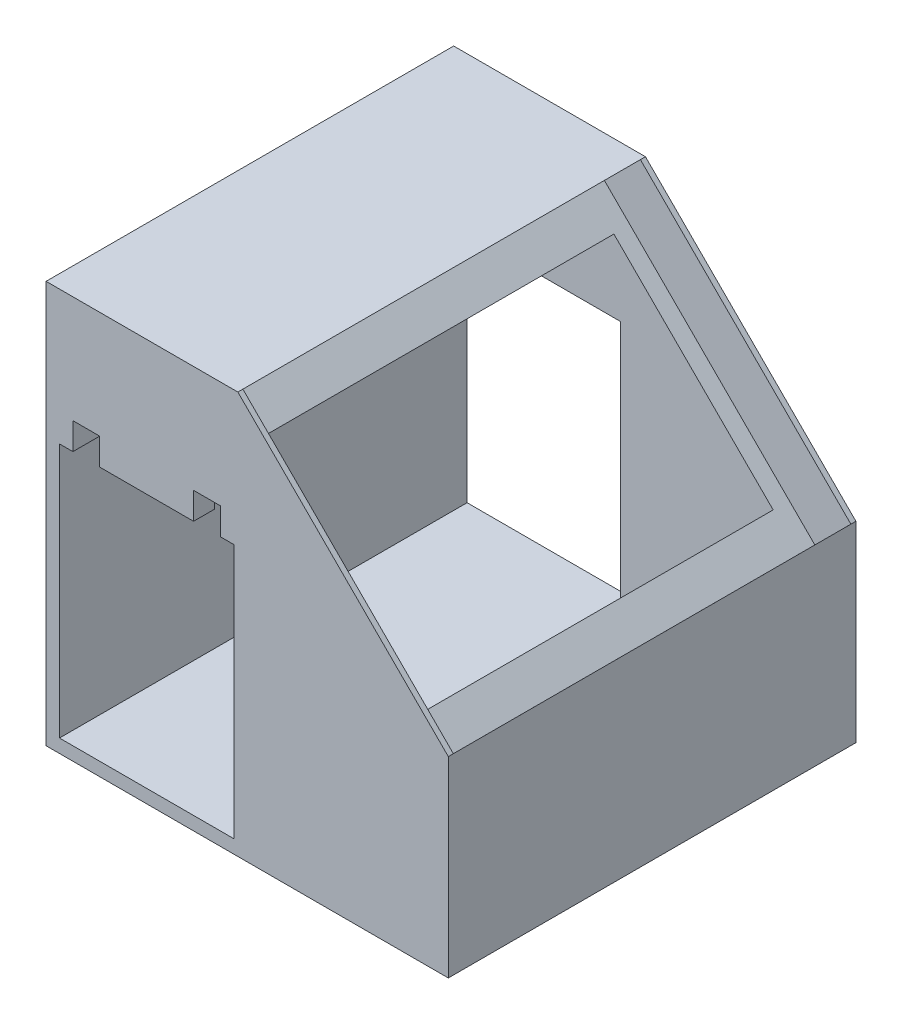
ISO-10303-21;
HEADER;
FILE_DESCRIPTION(('STEP AP214'),'2;1');
FILE_NAME('part.step','',(''),(''),'','','');
FILE_SCHEMA(('AUTOMOTIVE_DESIGN { 1 0 10303 214 1 1 1 1 }'));
ENDSEC;
DATA;
#1=APPLICATION_CONTEXT('core data for automotive mechanical design processes');
#2=APPLICATION_PROTOCOL_DEFINITION('international standard','automotive_design',2000,#1);
#3=PRODUCT_CONTEXT('',#1,'mechanical');
#4=PRODUCT('Part','Part','',(#3));
#5=PRODUCT_RELATED_PRODUCT_CATEGORY('part','',(#4));
#6=PRODUCT_DEFINITION_FORMATION('','',#4);
#7=PRODUCT_DEFINITION_CONTEXT('part definition',#1,'design');
#8=PRODUCT_DEFINITION('design','',#6,#7);
#9=PRODUCT_DEFINITION_SHAPE('','',#8);
#10=(LENGTH_UNIT() NAMED_UNIT(*) SI_UNIT(.MILLI.,.METRE.));
#11=(NAMED_UNIT(*) PLANE_ANGLE_UNIT() SI_UNIT($,.RADIAN.));
#12=(NAMED_UNIT(*) SI_UNIT($,.STERADIAN.) SOLID_ANGLE_UNIT());
#13=UNCERTAINTY_MEASURE_WITH_UNIT(LENGTH_MEASURE(1.E-05),#10,'distance_accuracy_value','');
#14=(GEOMETRIC_REPRESENTATION_CONTEXT(3) GLOBAL_UNCERTAINTY_ASSIGNED_CONTEXT((#13)) GLOBAL_UNIT_ASSIGNED_CONTEXT((#10,
#11,#12)) REPRESENTATION_CONTEXT('',''));
#15=CARTESIAN_POINT('',(0.,0.,0.));
#16=DIRECTION('',(0.,0.,1.));
#17=DIRECTION('',(1.,0.,0.));
#18=AXIS2_PLACEMENT_3D('',#15,#16,#17);
#19=CARTESIAN_POINT('',(5.,100.,152.));
#20=DIRECTION('',(0.,1.,0.));
#21=DIRECTION('',(0.,0.,1.));
#22=AXIS2_PLACEMENT_3D('',#19,#20,#21);
#23=PLANE('',#22);
#24=DIRECTION('',(0.,0.,1.));
#25=VECTOR('',#24,1.);
#26=CARTESIAN_POINT('',(20.,100.,112.));
#27=LINE('',#26,#25);
#28=CARTESIAN_POINT('',(20.,100.,118.));
#29=VERTEX_POINT('',#28);
#30=CARTESIAN_POINT('',(20.,100.,152.));
#31=VERTEX_POINT('',#30);
#32=EDGE_CURVE('E281',#29,#31,#27,.T.);
#33=ORIENTED_EDGE('',*,*,#32,.F.);
#34=DIRECTION('',(-1.,0.,0.));
#35=VECTOR('',#34,1.);
#36=CARTESIAN_POINT('',(20.,100.,118.));
#37=LINE('',#36,#35);
#38=CARTESIAN_POINT('',(40.6002750576431,100.,118.));
#39=VERTEX_POINT('',#38);
#40=EDGE_CURVE('E268',#39,#29,#37,.T.);
#41=ORIENTED_EDGE('',*,*,#40,.F.);
#42=DIRECTION('',(0.,0.,1.));
#43=VECTOR('',#42,1.);
#44=CARTESIAN_POINT('',(40.600275057643,100.,152.));
#45=LINE('',#44,#43);
#46=CARTESIAN_POINT('',(40.6002750576431,100.,144.125));
#47=VERTEX_POINT('',#46);
#48=EDGE_CURVE('E318',#39,#47,#45,.T.);
#49=ORIENTED_EDGE('',*,*,#48,.T.);
#50=DIRECTION('',(1.,0.,0.));
#51=VECTOR('',#50,1.);
#52=CARTESIAN_POINT('',(5.,100.,144.125));
#53=LINE('',#52,#51);
#54=CARTESIAN_POINT('',(55.,100.,144.125));
#55=VERTEX_POINT('',#54);
#56=EDGE_CURVE('E323',#47,#55,#53,.T.);
#57=ORIENTED_EDGE('',*,*,#56,.T.);
#58=DIRECTION('',(0.,0.,1.));
#59=VECTOR('',#58,1.);
#60=CARTESIAN_POINT('',(55.,100.,112.));
#61=LINE('',#60,#59);
#62=CARTESIAN_POINT('',(55.,100.,152.));
#63=VERTEX_POINT('',#62);
#64=EDGE_CURVE('E466',#55,#63,#61,.T.);
#65=ORIENTED_EDGE('',*,*,#64,.T.);
#66=DIRECTION('',(1.,0.,0.));
#67=VECTOR('',#66,1.);
#68=CARTESIAN_POINT('',(5.,100.,152.));
#69=LINE('',#68,#67);
#70=EDGE_CURVE('E372',#31,#63,#69,.T.);
#71=ORIENTED_EDGE('',*,*,#70,.F.);
#72=EDGE_LOOP('',(#33,#41,#49,#57,#65,#71));
#73=FACE_BOUND('',#72,.T.);
#74=ADVANCED_FACE('F64',(#73),#23,.F.);
#75=CARTESIAN_POINT('',(40.6002750576431,100.,7.87500000000002));
#76=VERTEX_POINT('',#75);
#77=CARTESIAN_POINT('',(40.6002750576431,100.,112.));
#78=VERTEX_POINT('',#77);
#79=EDGE_CURVE('E319',#76,#78,#45,.T.);
#80=ORIENTED_EDGE('',*,*,#79,.T.);
#81=DIRECTION('',(1.,0.,0.));
#82=VECTOR('',#81,1.);
#83=CARTESIAN_POINT('',(10.,100.,112.));
#84=LINE('',#83,#82);
#85=CARTESIAN_POINT('',(10.,100.,112.));
#86=VERTEX_POINT('',#85);
#87=EDGE_CURVE('E470',#86,#78,#84,.T.);
#88=ORIENTED_EDGE('',*,*,#87,.F.);
#89=DIRECTION('',(0.,0.,1.));
#90=VECTOR('',#89,1.);
#91=CARTESIAN_POINT('',(10.,100.,112.));
#92=LINE('',#91,#90);
#93=CARTESIAN_POINT('',(10.,100.,152.));
#94=VERTEX_POINT('',#93);
#95=EDGE_CURVE('E285',#86,#94,#92,.T.);
#96=ORIENTED_EDGE('',*,*,#95,.T.);
#97=CARTESIAN_POINT('',(5.,100.,152.));
#98=VERTEX_POINT('',#97);
#99=EDGE_CURVE('E368',#98,#94,#69,.T.);
#100=ORIENTED_EDGE('',*,*,#99,.F.);
#101=DIRECTION('',(0.,0.,-1.));
#102=VECTOR('',#101,1.);
#103=CARTESIAN_POINT('',(5.,100.,152.));
#104=LINE('',#103,#102);
#105=CARTESIAN_POINT('',(5.,100.,0.));
#106=VERTEX_POINT('',#105);
#107=EDGE_CURVE('E388',#98,#106,#104,.T.);
#108=ORIENTED_EDGE('',*,*,#107,.T.);
#109=DIRECTION('',(1.,0.,0.));
#110=VECTOR('',#109,1.);
#111=CARTESIAN_POINT('',(5.,100.,0.));
#112=LINE('',#111,#110);
#113=CARTESIAN_POINT('',(70.,100.,0.));
#114=VERTEX_POINT('',#113);
#115=EDGE_CURVE('E381',#106,#114,#112,.T.);
#116=ORIENTED_EDGE('',*,*,#115,.T.);
#117=DIRECTION('',(0.,0.,-1.));
#118=VECTOR('',#117,1.);
#119=CARTESIAN_POINT('',(70.,100.,152.));
#120=LINE('',#119,#118);
#121=CARTESIAN_POINT('',(70.,100.,7.87500000000002));
#122=VERTEX_POINT('',#121);
#123=EDGE_CURVE('E390',#122,#114,#120,.T.);
#124=ORIENTED_EDGE('',*,*,#123,.F.);
#125=DIRECTION('',(-1.,0.,0.));
#126=VECTOR('',#125,1.);
#127=CARTESIAN_POINT('',(5.,100.,7.87500000000002));
#128=LINE('',#127,#126);
#129=EDGE_CURVE('E313',#122,#76,#128,.T.);
#130=ORIENTED_EDGE('',*,*,#129,.T.);
#131=EDGE_LOOP('',(#80,#88,#96,#100,#108,#116,#124,#130));
#132=FACE_BOUND('',#131,.T.);
#133=ADVANCED_FACE('F482',(#132),#23,.F.);
#134=CARTESIAN_POINT('',(0.,0.,152.));
#135=DIRECTION('',(0.,0.,-1.));
#136=DIRECTION('',(-1.,0.,0.));
#137=AXIS2_PLACEMENT_3D('',#134,#135,#136);
#138=PLANE('',#137);
#139=DIRECTION('',(0.,1.,0.));
#140=VECTOR('',#139,1.);
#141=CARTESIAN_POINT('',(150.,0.,152.));
#142=LINE('',#141,#140);
#143=CARTESIAN_POINT('',(150.,0.,152.));
#144=VERTEX_POINT('',#143);
#145=CARTESIAN_POINT('',(150.,71.5111472899997,152.));
#146=VERTEX_POINT('',#145);
#147=EDGE_CURVE('E405',#144,#146,#142,.T.);
#148=ORIENTED_EDGE('',*,*,#147,.T.);
#149=DIRECTION('',(-0.707106781186546,0.707106781186549,0.));
#150=VECTOR('',#149,1.);
#151=CARTESIAN_POINT('',(71.51114729,150.,152.));
#152=LINE('',#151,#150);
#153=CARTESIAN_POINT('',(71.51114729,150.,152.));
#154=VERTEX_POINT('',#153);
#155=EDGE_CURVE('E434',#146,#154,#152,.T.);
#156=ORIENTED_EDGE('',*,*,#155,.T.);
#157=DIRECTION('',(1.,0.,0.));
#158=VECTOR('',#157,1.);
#159=CARTESIAN_POINT('',(0.,150.,152.));
#160=LINE('',#159,#158);
#161=CARTESIAN_POINT('',(0.,150.,152.));
#162=VERTEX_POINT('',#161);
#163=EDGE_CURVE('E401',#162,#154,#160,.T.);
#164=ORIENTED_EDGE('',*,*,#163,.F.);
#165=DIRECTION('',(0.,1.,0.));
#166=VECTOR('',#165,1.);
#167=CARTESIAN_POINT('',(0.,0.,152.));
#168=LINE('',#167,#166);
#169=CARTESIAN_POINT('',(0.,0.,152.));
#170=VERTEX_POINT('',#169);
#171=EDGE_CURVE('E398',#170,#162,#168,.T.);
#172=ORIENTED_EDGE('',*,*,#171,.F.);
#173=DIRECTION('',(1.,0.,0.));
#174=VECTOR('',#173,1.);
#175=CARTESIAN_POINT('',(0.,0.,152.));
#176=LINE('',#175,#174);
#177=EDGE_CURVE('E408',#170,#144,#176,.T.);
#178=ORIENTED_EDGE('',*,*,#177,.T.);
#179=EDGE_LOOP('',(#148,#156,#164,#172,#178));
#180=FACE_BOUND('',#179,.T.);
#181=ORIENTED_EDGE('',*,*,#70,.T.);
#182=DIRECTION('',(0.,-1.,0.));
#183=VECTOR('',#182,1.);
#184=CARTESIAN_POINT('',(55.,110.,152.));
#185=LINE('',#184,#183);
#186=CARTESIAN_POINT('',(55.,110.,152.));
#187=VERTEX_POINT('',#186);
#188=EDGE_CURVE('E494',#187,#63,#185,.T.);
#189=ORIENTED_EDGE('',*,*,#188,.F.);
#190=DIRECTION('',(-1.,0.,0.));
#191=VECTOR('',#190,1.);
#192=CARTESIAN_POINT('',(55.,110.,152.));
#193=LINE('',#192,#191);
#194=CARTESIAN_POINT('',(65.,110.,152.));
#195=VERTEX_POINT('',#194);
#196=EDGE_CURVE('E454',#195,#187,#193,.T.);
#197=ORIENTED_EDGE('',*,*,#196,.F.);
#198=DIRECTION('',(0.,1.,0.));
#199=VECTOR('',#198,1.);
#200=CARTESIAN_POINT('',(65.,110.,152.));
#201=LINE('',#200,#199);
#202=CARTESIAN_POINT('',(65.,100.,152.));
#203=VERTEX_POINT('',#202);
#204=EDGE_CURVE('E498',#203,#195,#201,.T.);
#205=ORIENTED_EDGE('',*,*,#204,.F.);
#206=CARTESIAN_POINT('',(70.,100.,152.));
#207=VERTEX_POINT('',#206);
#208=EDGE_CURVE('E367',#203,#207,#69,.T.);
#209=ORIENTED_EDGE('',*,*,#208,.T.);
#210=DIRECTION('',(0.,1.,0.));
#211=VECTOR('',#210,1.);
#212=CARTESIAN_POINT('',(70.,5.,152.));
#213=LINE('',#212,#211);
#214=CARTESIAN_POINT('',(70.,5.,152.));
#215=VERTEX_POINT('',#214);
#216=EDGE_CURVE('E363',#215,#207,#213,.T.);
#217=ORIENTED_EDGE('',*,*,#216,.F.);
#218=DIRECTION('',(1.,0.,0.));
#219=VECTOR('',#218,1.);
#220=CARTESIAN_POINT('',(5.,5.,152.));
#221=LINE('',#220,#219);
#222=CARTESIAN_POINT('',(5.,5.,152.));
#223=VERTEX_POINT('',#222);
#224=EDGE_CURVE('E361',#223,#215,#221,.T.);
#225=ORIENTED_EDGE('',*,*,#224,.F.);
#226=DIRECTION('',(0.,1.,0.));
#227=VECTOR('',#226,1.);
#228=CARTESIAN_POINT('',(5.,5.,152.));
#229=LINE('',#228,#227);
#230=EDGE_CURVE('E371',#223,#98,#229,.T.);
#231=ORIENTED_EDGE('',*,*,#230,.T.);
#232=ORIENTED_EDGE('',*,*,#99,.T.);
#233=DIRECTION('',(0.,-1.,0.));
#234=VECTOR('',#233,1.);
#235=CARTESIAN_POINT('',(10.,110.,152.));
#236=LINE('',#235,#234);
#237=CARTESIAN_POINT('',(10.,110.,152.));
#238=VERTEX_POINT('',#237);
#239=EDGE_CURVE('E457',#238,#94,#236,.T.);
#240=ORIENTED_EDGE('',*,*,#239,.F.);
#241=DIRECTION('',(-1.,0.,0.));
#242=VECTOR('',#241,1.);
#243=CARTESIAN_POINT('',(10.,110.,152.));
#244=LINE('',#243,#242);
#245=CARTESIAN_POINT('',(20.,110.,152.));
#246=VERTEX_POINT('',#245);
#247=EDGE_CURVE('E471',#246,#238,#244,.T.);
#248=ORIENTED_EDGE('',*,*,#247,.F.);
#249=DIRECTION('',(0.,1.,0.));
#250=VECTOR('',#249,1.);
#251=CARTESIAN_POINT('',(20.,110.,152.));
#252=LINE('',#251,#250);
#253=EDGE_CURVE('E278',#31,#246,#252,.T.);
#254=ORIENTED_EDGE('',*,*,#253,.F.);
#255=EDGE_LOOP('',(#181,#189,#197,#205,#209,#217,#225,#231,#232,#240,#248,#254));
#256=FACE_BOUND('',#255,.T.);
#257=ADVANCED_FACE('F477',(#180,#256),#138,.F.);
#258=CARTESIAN_POINT('',(0.,0.,0.));
#259=DIRECTION('',(0.,0.,-1.));
#260=DIRECTION('',(-1.,0.,0.));
#261=AXIS2_PLACEMENT_3D('',#258,#259,#260);
#262=PLANE('',#261);
#263=DIRECTION('',(1.,0.,0.));
#264=VECTOR('',#263,1.);
#265=CARTESIAN_POINT('',(0.,150.,0.));
#266=LINE('',#265,#264);
#267=CARTESIAN_POINT('',(0.,150.,0.));
#268=VERTEX_POINT('',#267);
#269=CARTESIAN_POINT('',(71.51114729,150.,0.));
#270=VERTEX_POINT('',#269);
#271=EDGE_CURVE('E413',#268,#270,#266,.T.);
#272=ORIENTED_EDGE('',*,*,#271,.T.);
#273=DIRECTION('',(0.707106781186546,-0.707106781186549,0.));
#274=VECTOR('',#273,1.);
#275=CARTESIAN_POINT('',(110.755573645,110.755573645,0.));
#276=LINE('',#275,#274);
#277=CARTESIAN_POINT('',(150.,71.5111472899997,0.));
#278=VERTEX_POINT('',#277);
#279=EDGE_CURVE('E430',#270,#278,#276,.T.);
#280=ORIENTED_EDGE('',*,*,#279,.T.);
#281=DIRECTION('',(0.,1.,0.));
#282=VECTOR('',#281,1.);
#283=CARTESIAN_POINT('',(150.,0.,0.));
#284=LINE('',#283,#282);
#285=CARTESIAN_POINT('',(150.,0.,0.));
#286=VERTEX_POINT('',#285);
#287=EDGE_CURVE('E416',#286,#278,#284,.T.);
#288=ORIENTED_EDGE('',*,*,#287,.F.);
#289=DIRECTION('',(1.,0.,0.));
#290=VECTOR('',#289,1.);
#291=CARTESIAN_POINT('',(0.,0.,0.));
#292=LINE('',#291,#290);
#293=CARTESIAN_POINT('',(0.,0.,0.));
#294=VERTEX_POINT('',#293);
#295=EDGE_CURVE('E402',#294,#286,#292,.T.);
#296=ORIENTED_EDGE('',*,*,#295,.F.);
#297=DIRECTION('',(0.,1.,0.));
#298=VECTOR('',#297,1.);
#299=CARTESIAN_POINT('',(0.,0.,0.));
#300=LINE('',#299,#298);
#301=EDGE_CURVE('E397',#294,#268,#300,.T.);
#302=ORIENTED_EDGE('',*,*,#301,.T.);
#303=EDGE_LOOP('',(#272,#280,#288,#296,#302));
#304=FACE_BOUND('',#303,.T.);
#305=DIRECTION('',(0.,1.,0.));
#306=VECTOR('',#305,1.);
#307=CARTESIAN_POINT('',(5.,5.,0.));
#308=LINE('',#307,#306);
#309=CARTESIAN_POINT('',(5.,5.,0.));
#310=VERTEX_POINT('',#309);
#311=EDGE_CURVE('E364',#310,#106,#308,.T.);
#312=ORIENTED_EDGE('',*,*,#311,.F.);
#313=DIRECTION('',(1.,0.,0.));
#314=VECTOR('',#313,1.);
#315=CARTESIAN_POINT('',(5.,5.,0.));
#316=LINE('',#315,#314);
#317=CARTESIAN_POINT('',(70.,5.,0.));
#318=VERTEX_POINT('',#317);
#319=EDGE_CURVE('E360',#310,#318,#316,.T.);
#320=ORIENTED_EDGE('',*,*,#319,.T.);
#321=DIRECTION('',(0.,1.,0.));
#322=VECTOR('',#321,1.);
#323=CARTESIAN_POINT('',(70.,5.,0.));
#324=LINE('',#323,#322);
#325=EDGE_CURVE('E378',#318,#114,#324,.T.);
#326=ORIENTED_EDGE('',*,*,#325,.T.);
#327=ORIENTED_EDGE('',*,*,#115,.F.);
#328=EDGE_LOOP('',(#312,#320,#326,#327));
#329=FACE_BOUND('',#328,.T.);
#330=ADVANCED_FACE('F534',(#304,#329),#262,.T.);
#331=CARTESIAN_POINT('',(0.,0.,152.));
#332=DIRECTION('',(-1.,0.,0.));
#333=DIRECTION('',(0.,0.,1.));
#334=AXIS2_PLACEMENT_3D('',#331,#332,#333);
#335=PLANE('',#334);
#336=ORIENTED_EDGE('',*,*,#301,.F.);
#337=DIRECTION('',(0.,0.,-1.));
#338=VECTOR('',#337,1.);
#339=CARTESIAN_POINT('',(0.,0.,152.));
#340=LINE('',#339,#338);
#341=EDGE_CURVE('E420',#170,#294,#340,.T.);
#342=ORIENTED_EDGE('',*,*,#341,.F.);
#343=ORIENTED_EDGE('',*,*,#171,.T.);
#344=DIRECTION('',(0.,0.,-1.));
#345=VECTOR('',#344,1.);
#346=CARTESIAN_POINT('',(0.,150.,152.));
#347=LINE('',#346,#345);
#348=EDGE_CURVE('E410',#162,#268,#347,.T.);
#349=ORIENTED_EDGE('',*,*,#348,.T.);
#350=EDGE_LOOP('',(#336,#342,#343,#349));
#351=FACE_BOUND('',#350,.T.);
#352=ADVANCED_FACE('F573',(#351),#335,.T.);
#353=CARTESIAN_POINT('',(0.,0.,152.));
#354=DIRECTION('',(0.,1.,0.));
#355=DIRECTION('',(0.,0.,1.));
#356=AXIS2_PLACEMENT_3D('',#353,#354,#355);
#357=PLANE('',#356);
#358=ORIENTED_EDGE('',*,*,#295,.T.);
#359=DIRECTION('',(0.,0.,-1.));
#360=VECTOR('',#359,1.);
#361=CARTESIAN_POINT('',(150.,0.,152.));
#362=LINE('',#361,#360);
#363=EDGE_CURVE('E423',#144,#286,#362,.T.);
#364=ORIENTED_EDGE('',*,*,#363,.F.);
#365=ORIENTED_EDGE('',*,*,#177,.F.);
#366=ORIENTED_EDGE('',*,*,#341,.T.);
#367=EDGE_LOOP('',(#358,#364,#365,#366));
#368=FACE_BOUND('',#367,.T.);
#369=ADVANCED_FACE('F575',(#368),#357,.F.);
#370=CARTESIAN_POINT('',(150.,0.,152.));
#371=DIRECTION('',(-1.,0.,0.));
#372=DIRECTION('',(0.,0.,1.));
#373=AXIS2_PLACEMENT_3D('',#370,#371,#372);
#374=PLANE('',#373);
#375=ORIENTED_EDGE('',*,*,#287,.T.);
#376=DIRECTION('',(0.,0.,1.));
#377=VECTOR('',#376,1.);
#378=CARTESIAN_POINT('',(150.,71.5111472899997,152.));
#379=LINE('',#378,#377);
#380=EDGE_CURVE('E432',#278,#146,#379,.T.);
#381=ORIENTED_EDGE('',*,*,#380,.T.);
#382=ORIENTED_EDGE('',*,*,#147,.F.);
#383=ORIENTED_EDGE('',*,*,#363,.T.);
#384=EDGE_LOOP('',(#375,#381,#382,#383));
#385=FACE_BOUND('',#384,.T.);
#386=ADVANCED_FACE('F578',(#385),#374,.F.);
#387=CARTESIAN_POINT('',(0.,150.,152.));
#388=DIRECTION('',(0.,1.,0.));
#389=DIRECTION('',(0.,0.,1.));
#390=AXIS2_PLACEMENT_3D('',#387,#388,#389);
#391=PLANE('',#390);
#392=DIRECTION('',(1.,0.,0.));
#393=VECTOR('',#392,1.);
#394=CARTESIAN_POINT('',(0.,150.,150.125));
#395=LINE('',#394,#393);
#396=CARTESIAN_POINT('',(71.5083919656064,150.,150.125));
#397=VERTEX_POINT('',#396);
#398=CARTESIAN_POINT('',(71.51114729,150.,150.125));
#399=VERTEX_POINT('',#398);
#400=EDGE_CURVE('E358',#397,#399,#395,.T.);
#401=ORIENTED_EDGE('',*,*,#400,.F.);
#402=DIRECTION('',(0.,0.,1.));
#403=VECTOR('',#402,1.);
#404=CARTESIAN_POINT('',(71.5083919656064,150.,152.));
#405=LINE('',#404,#403);
#406=CARTESIAN_POINT('',(71.5083919656064,150.,1.87500000000002));
#407=VERTEX_POINT('',#406);
#408=EDGE_CURVE('E439',#407,#397,#405,.T.);
#409=ORIENTED_EDGE('',*,*,#408,.F.);
#410=DIRECTION('',(-1.,0.,0.));
#411=VECTOR('',#410,1.);
#412=CARTESIAN_POINT('',(0.,150.,1.87500000000002));
#413=LINE('',#412,#411);
#414=CARTESIAN_POINT('',(71.51114729,150.,1.87500000000002));
#415=VERTEX_POINT('',#414);
#416=EDGE_CURVE('E350',#415,#407,#413,.T.);
#417=ORIENTED_EDGE('',*,*,#416,.F.);
#418=DIRECTION('',(0.,0.,-1.));
#419=VECTOR('',#418,1.);
#420=CARTESIAN_POINT('',(71.51114729,150.,0.));
#421=LINE('',#420,#419);
#422=EDGE_CURVE('E422',#415,#270,#421,.T.);
#423=ORIENTED_EDGE('',*,*,#422,.T.);
#424=ORIENTED_EDGE('',*,*,#271,.F.);
#425=ORIENTED_EDGE('',*,*,#348,.F.);
#426=ORIENTED_EDGE('',*,*,#163,.T.);
#427=EDGE_CURVE('E427',#154,#399,#421,.T.);
#428=ORIENTED_EDGE('',*,*,#427,.T.);
#429=EDGE_LOOP('',(#401,#409,#417,#423,#424,#425,#426,#428));
#430=FACE_BOUND('',#429,.T.);
#431=ADVANCED_FACE('F565',(#430),#391,.T.);
#432=CARTESIAN_POINT('',(5.,5.,152.));
#433=DIRECTION('',(0.,1.,0.));
#434=DIRECTION('',(0.,0.,1.));
#435=AXIS2_PLACEMENT_3D('',#432,#433,#434);
#436=PLANE('',#435);
#437=ORIENTED_EDGE('',*,*,#319,.F.);
#438=DIRECTION('',(0.,0.,-1.));
#439=VECTOR('',#438,1.);
#440=CARTESIAN_POINT('',(5.,5.,152.));
#441=LINE('',#440,#439);
#442=EDGE_CURVE('E375',#223,#310,#441,.T.);
#443=ORIENTED_EDGE('',*,*,#442,.F.);
#444=ORIENTED_EDGE('',*,*,#224,.T.);
#445=DIRECTION('',(0.,0.,-1.));
#446=VECTOR('',#445,1.);
#447=CARTESIAN_POINT('',(70.,5.,152.));
#448=LINE('',#447,#446);
#449=EDGE_CURVE('E394',#215,#318,#448,.T.);
#450=ORIENTED_EDGE('',*,*,#449,.T.);
#451=EDGE_LOOP('',(#437,#443,#444,#450));
#452=FACE_BOUND('',#451,.T.);
#453=ADVANCED_FACE('F531',(#452),#436,.T.);
#454=CARTESIAN_POINT('',(70.,5.,152.));
#455=DIRECTION('',(-1.,0.,0.));
#456=DIRECTION('',(0.,0.,1.));
#457=AXIS2_PLACEMENT_3D('',#454,#455,#456);
#458=PLANE('',#457);
#459=DIRECTION('',(0.,1.,0.));
#460=VECTOR('',#459,1.);
#461=CARTESIAN_POINT('',(70.,5.,144.125));
#462=LINE('',#461,#460);
#463=CARTESIAN_POINT('',(70.,10.6057857030171,144.125));
#464=VERTEX_POINT('',#463);
#465=CARTESIAN_POINT('',(70.,100.,144.125));
#466=VERTEX_POINT('',#465);
#467=EDGE_CURVE('E326',#464,#466,#462,.T.);
#468=ORIENTED_EDGE('',*,*,#467,.F.);
#469=DIRECTION('',(0.,0.,1.));
#470=VECTOR('',#469,1.);
#471=CARTESIAN_POINT('',(70.,10.6057857030171,152.));
#472=LINE('',#471,#470);
#473=CARTESIAN_POINT('',(70.,10.6057857030171,7.87500000000002));
#474=VERTEX_POINT('',#473);
#475=EDGE_CURVE('E305',#474,#464,#472,.T.);
#476=ORIENTED_EDGE('',*,*,#475,.F.);
#477=DIRECTION('',(0.,-1.,0.));
#478=VECTOR('',#477,1.);
#479=CARTESIAN_POINT('',(70.,5.,7.87500000000002));
#480=LINE('',#479,#478);
#481=EDGE_CURVE('E316',#122,#474,#480,.T.);
#482=ORIENTED_EDGE('',*,*,#481,.F.);
#483=ORIENTED_EDGE('',*,*,#123,.T.);
#484=ORIENTED_EDGE('',*,*,#325,.F.);
#485=ORIENTED_EDGE('',*,*,#449,.F.);
#486=ORIENTED_EDGE('',*,*,#216,.T.);
#487=EDGE_CURVE('E391',#207,#466,#120,.T.);
#488=ORIENTED_EDGE('',*,*,#487,.T.);
#489=EDGE_LOOP('',(#468,#476,#482,#483,#484,#485,#486,#488));
#490=FACE_BOUND('',#489,.T.);
#491=ADVANCED_FACE('F522',(#490),#458,.T.);
#492=ORIENTED_EDGE('',*,*,#208,.F.);
#493=DIRECTION('',(0.,0.,1.));
#494=VECTOR('',#493,1.);
#495=CARTESIAN_POINT('',(65.,100.,112.));
#496=LINE('',#495,#494);
#497=CARTESIAN_POINT('',(65.,100.,144.125));
#498=VERTEX_POINT('',#497);
#499=EDGE_CURVE('E460',#498,#203,#496,.T.);
#500=ORIENTED_EDGE('',*,*,#499,.F.);
#501=EDGE_CURVE('E322',#498,#466,#53,.T.);
#502=ORIENTED_EDGE('',*,*,#501,.T.);
#503=ORIENTED_EDGE('',*,*,#487,.F.);
#504=EDGE_LOOP('',(#492,#500,#502,#503));
#505=FACE_BOUND('',#504,.T.);
#506=ADVANCED_FACE('F526',(#505),#23,.F.);
#507=CARTESIAN_POINT('',(5.,5.,152.));
#508=DIRECTION('',(-1.,0.,0.));
#509=DIRECTION('',(0.,0.,1.));
#510=AXIS2_PLACEMENT_3D('',#507,#508,#509);
#511=PLANE('',#510);
#512=ORIENTED_EDGE('',*,*,#311,.T.);
#513=ORIENTED_EDGE('',*,*,#107,.F.);
#514=ORIENTED_EDGE('',*,*,#230,.F.);
#515=ORIENTED_EDGE('',*,*,#442,.T.);
#516=EDGE_LOOP('',(#512,#513,#514,#515));
#517=FACE_BOUND('',#516,.T.);
#518=ADVANCED_FACE('F537',(#517),#511,.F.);
#519=CARTESIAN_POINT('',(71.51114729,150.,152.));
#520=DIRECTION('',(0.707106781186549,0.707106781186546,0.));
#521=DIRECTION('',(0.,0.,1.));
#522=AXIS2_PLACEMENT_3D('',#519,#520,#521);
#523=PLANE('',#522);
#524=DIRECTION('',(0.707106781186546,-0.707106781186549,0.));
#525=VECTOR('',#524,1.);
#526=CARTESIAN_POINT('',(71.51114729,150.,150.125));
#527=LINE('',#526,#525);
#528=CARTESIAN_POINT('',(149.99862233951,71.5125249504899,150.125));
#529=VERTEX_POINT('',#528);
#530=EDGE_CURVE('E436',#399,#529,#527,.T.);
#531=ORIENTED_EDGE('',*,*,#530,.F.);
#532=ORIENTED_EDGE('',*,*,#427,.F.);
#533=ORIENTED_EDGE('',*,*,#155,.F.);
#534=ORIENTED_EDGE('',*,*,#380,.F.);
#535=ORIENTED_EDGE('',*,*,#279,.F.);
#536=ORIENTED_EDGE('',*,*,#422,.F.);
#537=DIRECTION('',(-0.707106781186546,0.707106781186549,0.));
#538=VECTOR('',#537,1.);
#539=CARTESIAN_POINT('',(71.5097696278032,150.001377662197,1.87500000000002));
#540=LINE('',#539,#538);
#541=CARTESIAN_POINT('',(149.99862233951,71.5125249504899,1.87500000000002));
#542=VERTEX_POINT('',#541);
#543=EDGE_CURVE('E334',#542,#415,#540,.T.);
#544=ORIENTED_EDGE('',*,*,#543,.F.);
#545=DIRECTION('',(0.,0.,-1.));
#546=VECTOR('',#545,1.);
#547=CARTESIAN_POINT('',(149.99862233951,71.5125249504899,150.125));
#548=LINE('',#547,#546);
#549=EDGE_CURVE('E329',#529,#542,#548,.T.);
#550=ORIENTED_EDGE('',*,*,#549,.F.);
#551=EDGE_LOOP('',(#531,#532,#533,#534,#535,#536,#544,#550));
#552=FACE_BOUND('',#551,.T.);
#553=ADVANCED_FACE('F67',(#552),#523,.T.);
#554=CARTESIAN_POINT('',(58.0747407852588,136.566348819652,150.125));
#555=DIRECTION('',(0.,0.,1.));
#556=DIRECTION('',(1.,0.,0.));
#557=AXIS2_PLACEMENT_3D('',#554,#555,#556);
#558=PLANE('',#557);
#559=ORIENTED_EDGE('',*,*,#400,.T.);
#560=ORIENTED_EDGE('',*,*,#530,.T.);
#561=DIRECTION('',(0.707106781186549,0.707106781186546,0.));
#562=VECTOR('',#561,1.);
#563=CARTESIAN_POINT('',(136.563593496965,58.0774961079455,150.125));
#564=LINE('',#563,#562);
#565=CARTESIAN_POINT('',(136.563593496965,58.0774961079455,150.125));
#566=VERTEX_POINT('',#565);
#567=EDGE_CURVE('E343',#566,#529,#564,.T.);
#568=ORIENTED_EDGE('',*,*,#567,.F.);
#569=DIRECTION('',(0.707106781186546,-0.707106781186549,0.));
#570=VECTOR('',#569,1.);
#571=CARTESIAN_POINT('',(58.0747407852588,136.566348819652,150.125));
#572=LINE('',#571,#570);
#573=CARTESIAN_POINT('',(58.0747407852588,136.566348819652,150.125));
#574=VERTEX_POINT('',#573);
#575=EDGE_CURVE('E330',#574,#566,#572,.T.);
#576=ORIENTED_EDGE('',*,*,#575,.F.);
#577=DIRECTION('',(0.707106781186549,0.707106781186546,0.));
#578=VECTOR('',#577,1.);
#579=CARTESIAN_POINT('',(58.0747407852588,136.566348819652,150.125));
#580=LINE('',#579,#578);
#581=EDGE_CURVE('E347',#574,#397,#580,.T.);
#582=ORIENTED_EDGE('',*,*,#581,.T.);
#583=EDGE_LOOP('',(#559,#560,#568,#576,#582));
#584=FACE_BOUND('',#583,.T.);
#585=ADVANCED_FACE('F618',(#584),#558,.F.);
#586=CARTESIAN_POINT('',(58.0747407852588,136.566348819652,150.125));
#587=DIRECTION('',(-0.707106781186546,0.707106781186549,0.));
#588=DIRECTION('',(-0.707106781186549,-0.707106781186546,0.));
#589=AXIS2_PLACEMENT_3D('',#586,#587,#588);
#590=PLANE('',#589);
#591=ORIENTED_EDGE('',*,*,#408,.T.);
#592=ORIENTED_EDGE('',*,*,#581,.F.);
#593=DIRECTION('',(0.,0.,1.));
#594=VECTOR('',#593,1.);
#595=CARTESIAN_POINT('',(58.0747407852588,136.566348819652,150.125));
#596=LINE('',#595,#594);
#597=CARTESIAN_POINT('',(58.0747407852588,136.566348819652,1.87500000000002));
#598=VERTEX_POINT('',#597);
#599=EDGE_CURVE('E340',#598,#574,#596,.T.);
#600=ORIENTED_EDGE('',*,*,#599,.F.);
#601=DIRECTION('',(0.707106781186549,0.707106781186546,0.));
#602=VECTOR('',#601,1.);
#603=CARTESIAN_POINT('',(58.0747407852588,136.566348819652,1.87500000000002));
#604=LINE('',#603,#602);
#605=EDGE_CURVE('E351',#598,#407,#604,.T.);
#606=ORIENTED_EDGE('',*,*,#605,.T.);
#607=EDGE_LOOP('',(#591,#592,#600,#606));
#608=FACE_BOUND('',#607,.T.);
#609=ADVANCED_FACE('F621',(#608),#590,.F.);
#610=CARTESIAN_POINT('',(58.0747407852588,136.566348819652,1.87500000000002));
#611=DIRECTION('',(0.,0.,-1.));
#612=DIRECTION('',(-1.,0.,0.));
#613=AXIS2_PLACEMENT_3D('',#610,#611,#612);
#614=PLANE('',#613);
#615=ORIENTED_EDGE('',*,*,#416,.T.);
#616=ORIENTED_EDGE('',*,*,#605,.F.);
#617=DIRECTION('',(-0.707106781186546,0.707106781186549,0.));
#618=VECTOR('',#617,1.);
#619=CARTESIAN_POINT('',(58.0747407852588,136.566348819652,1.87500000000002));
#620=LINE('',#619,#618);
#621=CARTESIAN_POINT('',(136.563593496965,58.0774961079455,1.87500000000002));
#622=VERTEX_POINT('',#621);
#623=EDGE_CURVE('E337',#622,#598,#620,.T.);
#624=ORIENTED_EDGE('',*,*,#623,.F.);
#625=DIRECTION('',(0.707106781186549,0.707106781186546,0.));
#626=VECTOR('',#625,1.);
#627=CARTESIAN_POINT('',(136.563593496965,58.0774961079455,1.87500000000002));
#628=LINE('',#627,#626);
#629=EDGE_CURVE('E354',#622,#542,#628,.T.);
#630=ORIENTED_EDGE('',*,*,#629,.T.);
#631=ORIENTED_EDGE('',*,*,#543,.T.);
#632=EDGE_LOOP('',(#615,#616,#624,#630,#631));
#633=FACE_BOUND('',#632,.T.);
#634=ADVANCED_FACE('F611',(#633),#614,.F.);
#635=CARTESIAN_POINT('',(136.563593496965,58.0774961079455,150.125));
#636=DIRECTION('',(0.707106781186546,-0.707106781186549,0.));
#637=DIRECTION('',(0.707106781186549,0.707106781186546,0.));
#638=AXIS2_PLACEMENT_3D('',#635,#636,#637);
#639=PLANE('',#638);
#640=ORIENTED_EDGE('',*,*,#549,.T.);
#641=ORIENTED_EDGE('',*,*,#629,.F.);
#642=DIRECTION('',(0.,0.,-1.));
#643=VECTOR('',#642,1.);
#644=CARTESIAN_POINT('',(136.563593496965,58.0774961079455,150.125));
#645=LINE('',#644,#643);
#646=EDGE_CURVE('E333',#566,#622,#645,.T.);
#647=ORIENTED_EDGE('',*,*,#646,.F.);
#648=ORIENTED_EDGE('',*,*,#567,.T.);
#649=EDGE_LOOP('',(#640,#641,#647,#648));
#650=FACE_BOUND('',#649,.T.);
#651=ADVANCED_FACE('F615',(#650),#639,.F.);
#652=CARTESIAN_POINT('',(97.3205448024557,97.3205448024553,0.));
#653=DIRECTION('',(0.707106781186549,0.707106781186546,0.));
#654=DIRECTION('',(-0.707106781186546,0.707106781186549,0.));
#655=AXIS2_PLACEMENT_3D('',#652,#653,#654);
#656=PLANE('',#655);
#657=DIRECTION('',(0.707106781186546,-0.707106781186549,0.));
#658=VECTOR('',#657,1.);
#659=CARTESIAN_POINT('',(67.6206823312772,127.020407273634,144.125));
#660=LINE('',#659,#658);
#661=CARTESIAN_POINT('',(67.6206823312772,127.020407273634,144.125));
#662=VERTEX_POINT('',#661);
#663=CARTESIAN_POINT('',(127.017651950947,67.6234376539639,144.125));
#664=VERTEX_POINT('',#663);
#665=EDGE_CURVE('E283',#662,#664,#660,.T.);
#666=ORIENTED_EDGE('',*,*,#665,.F.);
#667=DIRECTION('',(0.,0.,1.));
#668=VECTOR('',#667,1.);
#669=CARTESIAN_POINT('',(67.6206823312772,127.020407273634,144.125));
#670=LINE('',#669,#668);
#671=CARTESIAN_POINT('',(67.6206823312772,127.020407273634,7.87500000000002));
#672=VERTEX_POINT('',#671);
#673=EDGE_CURVE('E299',#672,#662,#670,.T.);
#674=ORIENTED_EDGE('',*,*,#673,.F.);
#675=DIRECTION('',(-0.707106781186546,0.707106781186549,0.));
#676=VECTOR('',#675,1.);
#677=CARTESIAN_POINT('',(67.6206823312772,127.020407273634,7.87500000000002));
#678=LINE('',#677,#676);
#679=CARTESIAN_POINT('',(127.017651950947,67.6234376539639,7.87500000000002));
#680=VERTEX_POINT('',#679);
#681=EDGE_CURVE('E296',#680,#672,#678,.T.);
#682=ORIENTED_EDGE('',*,*,#681,.F.);
#683=DIRECTION('',(0.,0.,-1.));
#684=VECTOR('',#683,1.);
#685=CARTESIAN_POINT('',(127.017651950947,67.6234376539639,144.125));
#686=LINE('',#685,#684);
#687=EDGE_CURVE('E293',#664,#680,#686,.T.);
#688=ORIENTED_EDGE('',*,*,#687,.F.);
#689=EDGE_LOOP('',(#666,#674,#682,#688));
#690=FACE_BOUND('',#689,.T.);
#691=ORIENTED_EDGE('',*,*,#575,.T.);
#692=ORIENTED_EDGE('',*,*,#646,.T.);
#693=ORIENTED_EDGE('',*,*,#623,.T.);
#694=ORIENTED_EDGE('',*,*,#599,.T.);
#695=EDGE_LOOP('',(#691,#692,#693,#694));
#696=FACE_BOUND('',#695,.T.);
#697=ADVANCED_FACE('F512',(#690,#696),#656,.T.);
#698=CARTESIAN_POINT('',(10.3450330551667,69.7447579975238,144.125));
#699=DIRECTION('',(-0.707106781186546,0.707106781186549,0.));
#700=DIRECTION('',(-0.707106781186549,-0.707106781186546,0.));
#701=AXIS2_PLACEMENT_3D('',#698,#699,#700);
#702=PLANE('',#701);
#703=ORIENTED_EDGE('',*,*,#48,.F.);
#704=DIRECTION('',(0.707106781186549,0.707106781186546,0.));
#705=VECTOR('',#704,1.);
#706=CARTESIAN_POINT('',(10.3450330551667,69.7447579975238,118.));
#707=LINE('',#706,#705);
#708=CARTESIAN_POINT('',(50.6002750576431,110.,118.));
#709=VERTEX_POINT('',#708);
#710=EDGE_CURVE('E492',#39,#709,#707,.T.);
#711=ORIENTED_EDGE('',*,*,#710,.T.);
#712=DIRECTION('',(0.,0.,-1.));
#713=VECTOR('',#712,1.);
#714=CARTESIAN_POINT('',(50.6002750576431,110.,144.125));
#715=LINE('',#714,#713);
#716=CARTESIAN_POINT('',(50.6002750576431,110.,112.));
#717=VERTEX_POINT('',#716);
#718=EDGE_CURVE('E264',#709,#717,#715,.T.);
#719=ORIENTED_EDGE('',*,*,#718,.T.);
#720=DIRECTION('',(-0.707106781186549,-0.707106781186546,0.));
#721=VECTOR('',#720,1.);
#722=CARTESIAN_POINT('',(10.3450330551667,69.7447579975238,112.));
#723=LINE('',#722,#721);
#724=EDGE_CURVE('E488',#717,#78,#723,.T.);
#725=ORIENTED_EDGE('',*,*,#724,.T.);
#726=ORIENTED_EDGE('',*,*,#79,.F.);
#727=DIRECTION('',(0.707106781186549,0.707106781186546,0.));
#728=VECTOR('',#727,1.);
#729=CARTESIAN_POINT('',(10.3450330551667,69.7447579975238,7.87500000000002));
#730=LINE('',#729,#728);
#731=EDGE_CURVE('E306',#76,#672,#730,.T.);
#732=ORIENTED_EDGE('',*,*,#731,.T.);
#733=ORIENTED_EDGE('',*,*,#673,.T.);
#734=DIRECTION('',(0.707106781186549,0.707106781186546,0.));
#735=VECTOR('',#734,1.);
#736=CARTESIAN_POINT('',(10.3450330551667,69.7447579975238,144.125));
#737=LINE('',#736,#735);
#738=EDGE_CURVE('E303',#47,#662,#737,.T.);
#739=ORIENTED_EDGE('',*,*,#738,.F.);
#740=EDGE_LOOP('',(#703,#711,#719,#725,#726,#732,#733,#739));
#741=FACE_BOUND('',#740,.T.);
#742=ADVANCED_FACE('F491',(#741),#702,.F.);
#743=CARTESIAN_POINT('',(10.3450330551667,69.7447579975238,144.125));
#744=DIRECTION('',(0.,0.,1.));
#745=DIRECTION('',(1.,0.,0.));
#746=AXIS2_PLACEMENT_3D('',#743,#744,#745);
#747=PLANE('',#746);
#748=DIRECTION('',(-1.,0.,0.));
#749=VECTOR('',#748,1.);
#750=CARTESIAN_POINT('',(10.3450330551667,110.,144.125));
#751=LINE('',#750,#749);
#752=CARTESIAN_POINT('',(65.,110.,144.125));
#753=VERTEX_POINT('',#752);
#754=CARTESIAN_POINT('',(55.,110.,144.125));
#755=VERTEX_POINT('',#754);
#756=EDGE_CURVE('E73',#753,#755,#751,.T.);
#757=ORIENTED_EDGE('',*,*,#756,.T.);
#758=DIRECTION('',(0.,-1.,0.));
#759=VECTOR('',#758,1.);
#760=CARTESIAN_POINT('',(55.,69.7447579975238,144.125));
#761=LINE('',#760,#759);
#762=EDGE_CURVE('E12',#755,#55,#761,.T.);
#763=ORIENTED_EDGE('',*,*,#762,.T.);
#764=ORIENTED_EDGE('',*,*,#56,.F.);
#765=ORIENTED_EDGE('',*,*,#738,.T.);
#766=ORIENTED_EDGE('',*,*,#665,.T.);
#767=DIRECTION('',(0.707106781186549,0.707106781186546,0.));
#768=VECTOR('',#767,1.);
#769=CARTESIAN_POINT('',(69.7420026748366,10.3477883778537,144.125));
#770=LINE('',#769,#768);
#771=EDGE_CURVE('E302',#464,#664,#770,.T.);
#772=ORIENTED_EDGE('',*,*,#771,.F.);
#773=ORIENTED_EDGE('',*,*,#467,.T.);
#774=ORIENTED_EDGE('',*,*,#501,.F.);
#775=DIRECTION('',(0.,1.,0.));
#776=VECTOR('',#775,1.);
#777=CARTESIAN_POINT('',(65.,69.7447579975238,144.125));
#778=LINE('',#777,#776);
#779=EDGE_CURVE('E441',#498,#753,#778,.T.);
#780=ORIENTED_EDGE('',*,*,#779,.T.);
#781=EDGE_LOOP('',(#757,#763,#764,#765,#766,#772,#773,#774,#780));
#782=FACE_BOUND('',#781,.T.);
#783=ADVANCED_FACE('F445',(#782),#747,.F.);
#784=CARTESIAN_POINT('',(10.3450330551667,69.7447579975238,7.87500000000002));
#785=DIRECTION('',(0.,0.,-1.));
#786=DIRECTION('',(-1.,0.,0.));
#787=AXIS2_PLACEMENT_3D('',#784,#785,#786);
#788=PLANE('',#787);
#789=ORIENTED_EDGE('',*,*,#481,.T.);
#790=DIRECTION('',(0.707106781186549,0.707106781186546,0.));
#791=VECTOR('',#790,1.);
#792=CARTESIAN_POINT('',(69.7420026748366,10.3477883778537,7.87500000000002));
#793=LINE('',#792,#791);
#794=EDGE_CURVE('E308',#474,#680,#793,.T.);
#795=ORIENTED_EDGE('',*,*,#794,.T.);
#796=ORIENTED_EDGE('',*,*,#681,.T.);
#797=ORIENTED_EDGE('',*,*,#731,.F.);
#798=ORIENTED_EDGE('',*,*,#129,.F.);
#799=EDGE_LOOP('',(#789,#795,#796,#797,#798));
#800=FACE_BOUND('',#799,.T.);
#801=ADVANCED_FACE('F540',(#800),#788,.F.);
#802=CARTESIAN_POINT('',(69.7420026748366,10.3477883778537,144.125));
#803=DIRECTION('',(0.707106781186546,-0.707106781186549,0.));
#804=DIRECTION('',(0.707106781186549,0.707106781186546,0.));
#805=AXIS2_PLACEMENT_3D('',#802,#803,#804);
#806=PLANE('',#805);
#807=ORIENTED_EDGE('',*,*,#475,.T.);
#808=ORIENTED_EDGE('',*,*,#771,.T.);
#809=ORIENTED_EDGE('',*,*,#687,.T.);
#810=ORIENTED_EDGE('',*,*,#794,.F.);
#811=EDGE_LOOP('',(#807,#808,#809,#810));
#812=FACE_BOUND('',#811,.T.);
#813=ADVANCED_FACE('F517',(#812),#806,.F.);
#814=CARTESIAN_POINT('',(10.,110.,112.));
#815=DIRECTION('',(-1.,0.,0.));
#816=DIRECTION('',(0.,-1.,0.));
#817=AXIS2_PLACEMENT_3D('',#814,#815,#816);
#818=PLANE('',#817);
#819=ORIENTED_EDGE('',*,*,#239,.T.);
#820=ORIENTED_EDGE('',*,*,#95,.F.);
#821=DIRECTION('',(0.,-1.,0.));
#822=VECTOR('',#821,1.);
#823=CARTESIAN_POINT('',(10.,110.,112.));
#824=LINE('',#823,#822);
#825=CARTESIAN_POINT('',(10.,110.,112.));
#826=VERTEX_POINT('',#825);
#827=EDGE_CURVE('E88',#826,#86,#824,.T.);
#828=ORIENTED_EDGE('',*,*,#827,.F.);
#829=DIRECTION('',(0.,0.,1.));
#830=VECTOR('',#829,1.);
#831=CARTESIAN_POINT('',(10.,110.,112.));
#832=LINE('',#831,#830);
#833=EDGE_CURVE('E280',#826,#238,#832,.T.);
#834=ORIENTED_EDGE('',*,*,#833,.T.);
#835=EDGE_LOOP('',(#819,#820,#828,#834));
#836=FACE_BOUND('',#835,.T.);
#837=ADVANCED_FACE('F479',(#836),#818,.F.);
#838=CARTESIAN_POINT('',(10.,110.,112.));
#839=DIRECTION('',(0.,1.,0.));
#840=DIRECTION('',(0.,0.,1.));
#841=AXIS2_PLACEMENT_3D('',#838,#839,#840);
#842=PLANE('',#841);
#843=ORIENTED_EDGE('',*,*,#247,.T.);
#844=ORIENTED_EDGE('',*,*,#833,.F.);
#845=DIRECTION('',(-1.,0.,0.));
#846=VECTOR('',#845,1.);
#847=CARTESIAN_POINT('',(10.,110.,112.));
#848=LINE('',#847,#846);
#849=EDGE_CURVE('E291',#717,#826,#848,.T.);
#850=ORIENTED_EDGE('',*,*,#849,.F.);
#851=ORIENTED_EDGE('',*,*,#718,.F.);
#852=DIRECTION('',(-1.,0.,0.));
#853=VECTOR('',#852,1.);
#854=CARTESIAN_POINT('',(20.,110.,118.));
#855=LINE('',#854,#853);
#856=CARTESIAN_POINT('',(20.,110.,118.));
#857=VERTEX_POINT('',#856);
#858=EDGE_CURVE('E256',#709,#857,#855,.T.);
#859=ORIENTED_EDGE('',*,*,#858,.T.);
#860=DIRECTION('',(0.,0.,1.));
#861=VECTOR('',#860,1.);
#862=CARTESIAN_POINT('',(20.,110.,112.));
#863=LINE('',#862,#861);
#864=EDGE_CURVE('E261',#857,#246,#863,.T.);
#865=ORIENTED_EDGE('',*,*,#864,.T.);
#866=EDGE_LOOP('',(#843,#844,#850,#851,#859,#865));
#867=FACE_BOUND('',#866,.T.);
#868=ADVANCED_FACE('F259',(#867),#842,.F.);
#869=CARTESIAN_POINT('',(20.,110.,112.));
#870=DIRECTION('',(1.,0.,0.));
#871=DIRECTION('',(0.,1.,0.));
#872=AXIS2_PLACEMENT_3D('',#869,#870,#871);
#873=PLANE('',#872);
#874=ORIENTED_EDGE('',*,*,#864,.F.);
#875=DIRECTION('',(0.,-1.,0.));
#876=VECTOR('',#875,1.);
#877=CARTESIAN_POINT('',(20.,110.,118.));
#878=LINE('',#877,#876);
#879=EDGE_CURVE('E267',#857,#29,#878,.T.);
#880=ORIENTED_EDGE('',*,*,#879,.T.);
#881=ORIENTED_EDGE('',*,*,#32,.T.);
#882=ORIENTED_EDGE('',*,*,#253,.T.);
#883=EDGE_LOOP('',(#874,#880,#881,#882));
#884=FACE_BOUND('',#883,.T.);
#885=ADVANCED_FACE('F276',(#884),#873,.F.);
#886=CARTESIAN_POINT('',(0.,0.,112.));
#887=DIRECTION('',(0.,0.,1.));
#888=DIRECTION('',(1.,0.,0.));
#889=AXIS2_PLACEMENT_3D('',#886,#887,#888);
#890=PLANE('',#889);
#891=ORIENTED_EDGE('',*,*,#827,.T.);
#892=ORIENTED_EDGE('',*,*,#87,.T.);
#893=ORIENTED_EDGE('',*,*,#724,.F.);
#894=ORIENTED_EDGE('',*,*,#849,.T.);
#895=EDGE_LOOP('',(#891,#892,#893,#894));
#896=FACE_BOUND('',#895,.T.);
#897=ADVANCED_FACE('F487',(#896),#890,.T.);
#898=CARTESIAN_POINT('',(55.,110.,112.));
#899=DIRECTION('',(-1.,0.,0.));
#900=DIRECTION('',(0.,0.,1.));
#901=AXIS2_PLACEMENT_3D('',#898,#899,#900);
#902=PLANE('',#901);
#903=DIRECTION('',(0.,0.,1.));
#904=VECTOR('',#903,1.);
#905=CARTESIAN_POINT('',(55.,110.,112.));
#906=LINE('',#905,#904);
#907=EDGE_CURVE('E452',#755,#187,#906,.T.);
#908=ORIENTED_EDGE('',*,*,#907,.T.);
#909=ORIENTED_EDGE('',*,*,#188,.T.);
#910=ORIENTED_EDGE('',*,*,#64,.F.);
#911=ORIENTED_EDGE('',*,*,#762,.F.);
#912=EDGE_LOOP('',(#908,#909,#910,#911));
#913=FACE_BOUND('',#912,.T.);
#914=ADVANCED_FACE('F504',(#913),#902,.F.);
#915=CARTESIAN_POINT('',(55.,110.,112.));
#916=DIRECTION('',(0.,1.,0.));
#917=DIRECTION('',(0.,0.,1.));
#918=AXIS2_PLACEMENT_3D('',#915,#916,#917);
#919=PLANE('',#918);
#920=DIRECTION('',(0.,0.,1.));
#921=VECTOR('',#920,1.);
#922=CARTESIAN_POINT('',(65.,110.,112.));
#923=LINE('',#922,#921);
#924=EDGE_CURVE('E80',#753,#195,#923,.T.);
#925=ORIENTED_EDGE('',*,*,#924,.T.);
#926=ORIENTED_EDGE('',*,*,#196,.T.);
#927=ORIENTED_EDGE('',*,*,#907,.F.);
#928=ORIENTED_EDGE('',*,*,#756,.F.);
#929=EDGE_LOOP('',(#925,#926,#927,#928));
#930=FACE_BOUND('',#929,.T.);
#931=ADVANCED_FACE('F450',(#930),#919,.F.);
#932=CARTESIAN_POINT('',(65.,110.,112.));
#933=DIRECTION('',(1.,0.,0.));
#934=DIRECTION('',(0.,0.,-1.));
#935=AXIS2_PLACEMENT_3D('',#932,#933,#934);
#936=PLANE('',#935);
#937=ORIENTED_EDGE('',*,*,#499,.T.);
#938=ORIENTED_EDGE('',*,*,#204,.T.);
#939=ORIENTED_EDGE('',*,*,#924,.F.);
#940=ORIENTED_EDGE('',*,*,#779,.F.);
#941=EDGE_LOOP('',(#937,#938,#939,#940));
#942=FACE_BOUND('',#941,.T.);
#943=ADVANCED_FACE('F500',(#942),#936,.F.);
#944=CARTESIAN_POINT('',(20.,110.,118.));
#945=DIRECTION('',(0.,0.,1.));
#946=DIRECTION('',(1.,0.,0.));
#947=AXIS2_PLACEMENT_3D('',#944,#945,#946);
#948=PLANE('',#947);
#949=ORIENTED_EDGE('',*,*,#40,.T.);
#950=ORIENTED_EDGE('',*,*,#879,.F.);
#951=ORIENTED_EDGE('',*,*,#858,.F.);
#952=ORIENTED_EDGE('',*,*,#710,.F.);
#953=EDGE_LOOP('',(#949,#950,#951,#952));
#954=FACE_BOUND('',#953,.T.);
#955=ADVANCED_FACE('F271',(#954),#948,.F.);
#956=CLOSED_SHELL('',(#74,#133,#257,#330,#352,#369,#386,#431,#453,#491,#506,#518,#553,#585,#609,
#634,#651,#697,#742,#783,#801,#813,#837,#868,#885,#897,#914,#931,#943,#955));
#957=MANIFOLD_SOLID_BREP('B2',#956);
#958=ADVANCED_BREP_SHAPE_REPRESENTATION('',(#18,#957),#14);
#959=SHAPE_DEFINITION_REPRESENTATION(#9,#958);
ENDSEC;
END-ISO-10303-21;
